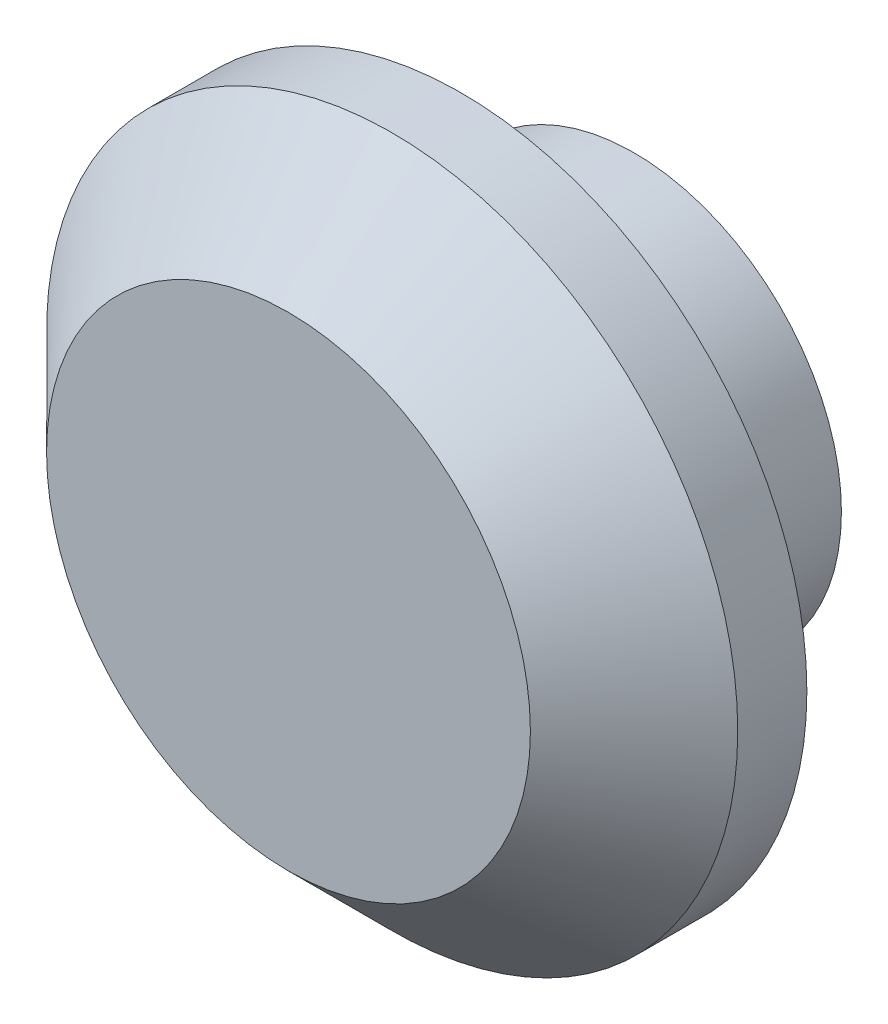
ISO-10303-21;
HEADER;
FILE_DESCRIPTION(('STEP AP214'),'2;1');
FILE_NAME('part.step','',(''),(''),'','','');
FILE_SCHEMA(('AUTOMOTIVE_DESIGN { 1 0 10303 214 1 1 1 1 }'));
ENDSEC;
DATA;
#1=APPLICATION_CONTEXT('core data for automotive mechanical design processes');
#2=APPLICATION_PROTOCOL_DEFINITION('international standard','automotive_design',2000,#1);
#3=PRODUCT_CONTEXT('',#1,'mechanical');
#4=PRODUCT('Part','Part','',(#3));
#5=PRODUCT_RELATED_PRODUCT_CATEGORY('part','',(#4));
#6=PRODUCT_DEFINITION_FORMATION('','',#4);
#7=PRODUCT_DEFINITION_CONTEXT('part definition',#1,'design');
#8=PRODUCT_DEFINITION('design','',#6,#7);
#9=PRODUCT_DEFINITION_SHAPE('','',#8);
#10=(LENGTH_UNIT() NAMED_UNIT(*) SI_UNIT(.MILLI.,.METRE.));
#11=(NAMED_UNIT(*) PLANE_ANGLE_UNIT() SI_UNIT($,.RADIAN.));
#12=(NAMED_UNIT(*) SI_UNIT($,.STERADIAN.) SOLID_ANGLE_UNIT());
#13=UNCERTAINTY_MEASURE_WITH_UNIT(LENGTH_MEASURE(1.E-05),#10,'distance_accuracy_value','');
#14=(GEOMETRIC_REPRESENTATION_CONTEXT(3) GLOBAL_UNCERTAINTY_ASSIGNED_CONTEXT((#13)) GLOBAL_UNIT_ASSIGNED_CONTEXT((#10,
#11,#12)) REPRESENTATION_CONTEXT('',''));
#15=CARTESIAN_POINT('',(0.,0.,0.));
#16=DIRECTION('',(0.,0.,1.));
#17=DIRECTION('',(1.,0.,0.));
#18=AXIS2_PLACEMENT_3D('',#15,#16,#17);
#19=CARTESIAN_POINT('',(0.,0.,5.));
#20=DIRECTION('',(0.,0.,-1.));
#21=DIRECTION('',(-1.,0.,0.));
#22=AXIS2_PLACEMENT_3D('',#19,#20,#21);
#23=CYLINDRICAL_SURFACE('',#22,6.);
#24=CARTESIAN_POINT('',(0.,0.,-5.));
#25=DIRECTION('',(0.,0.,1.));
#26=DIRECTION('',(1.,0.,0.));
#27=AXIS2_PLACEMENT_3D('',#24,#25,#26);
#28=CIRCLE('',#27,6.);
#29=CARTESIAN_POINT('',(6.,0.,-5.));
#30=VERTEX_POINT('',#29);
#31=EDGE_CURVE('E49',#30,#30,#28,.T.);
#32=ORIENTED_EDGE('',*,*,#31,.T.);
#33=EDGE_LOOP('',(#32));
#34=FACE_BOUND('',#33,.T.);
#35=CARTESIAN_POINT('',(0.,0.,0.));
#36=DIRECTION('',(0.,0.,1.));
#37=DIRECTION('',(1.,0.,0.));
#38=AXIS2_PLACEMENT_3D('',#35,#36,#37);
#39=CIRCLE('',#38,6.);
#40=CARTESIAN_POINT('',(6.,0.,0.));
#41=VERTEX_POINT('',#40);
#42=EDGE_CURVE('E45',#41,#41,#39,.T.);
#43=ORIENTED_EDGE('',*,*,#42,.F.);
#44=EDGE_LOOP('',(#43));
#45=FACE_BOUND('',#44,.T.);
#46=ADVANCED_FACE('F33',(#34,#45),#23,.T.);
#47=CARTESIAN_POINT('',(0.,0.,5.));
#48=DIRECTION('',(0.,0.,-1.));
#49=DIRECTION('',(-1.,0.,0.));
#50=AXIS2_PLACEMENT_3D('',#47,#48,#49);
#51=CYLINDRICAL_SURFACE('',#50,3.25);
#52=CARTESIAN_POINT('',(0.,0.,-5.));
#53=DIRECTION('',(0.,0.,1.));
#54=DIRECTION('',(1.,0.,0.));
#55=AXIS2_PLACEMENT_3D('',#52,#53,#54);
#56=CIRCLE('',#55,3.25);
#57=CARTESIAN_POINT('',(3.25000000000001,0.,-5.));
#58=VERTEX_POINT('',#57);
#59=EDGE_CURVE('E55',#58,#58,#56,.T.);
#60=ORIENTED_EDGE('',*,*,#59,.F.);
#61=EDGE_LOOP('',(#60));
#62=FACE_BOUND('',#61,.T.);
#63=CARTESIAN_POINT('',(0.,0.,0.));
#64=DIRECTION('',(0.,0.,1.));
#65=DIRECTION('',(1.,0.,0.));
#66=AXIS2_PLACEMENT_3D('',#63,#64,#65);
#67=CIRCLE('',#66,3.25);
#68=CARTESIAN_POINT('',(3.25000000000001,0.,0.));
#69=VERTEX_POINT('',#68);
#70=EDGE_CURVE('E52',#69,#69,#67,.T.);
#71=ORIENTED_EDGE('',*,*,#70,.T.);
#72=EDGE_LOOP('',(#71));
#73=FACE_BOUND('',#72,.T.);
#74=ADVANCED_FACE('F82',(#62,#73),#51,.F.);
#75=CARTESIAN_POINT('',(0.,0.,-5.));
#76=DIRECTION('',(0.,0.,1.));
#77=DIRECTION('',(1.,0.,0.));
#78=AXIS2_PLACEMENT_3D('',#75,#76,#77);
#79=PLANE('',#78);
#80=ORIENTED_EDGE('',*,*,#59,.T.);
#81=EDGE_LOOP('',(#80));
#82=FACE_BOUND('',#81,.T.);
#83=ORIENTED_EDGE('',*,*,#31,.F.);
#84=EDGE_LOOP('',(#83));
#85=FACE_BOUND('',#84,.T.);
#86=ADVANCED_FACE('F79',(#82,#85),#79,.F.);
#87=CARTESIAN_POINT('',(0.,0.,0.));
#88=DIRECTION('',(0.,0.,1.));
#89=DIRECTION('',(1.,0.,0.));
#90=AXIS2_PLACEMENT_3D('',#87,#88,#89);
#91=PLANE('',#90);
#92=ORIENTED_EDGE('',*,*,#70,.F.);
#93=EDGE_LOOP('',(#92));
#94=FACE_BOUND('',#93,.T.);
#95=ADVANCED_FACE('F71',(#94),#91,.F.);
#96=CARTESIAN_POINT('',(0.,0.,5.));
#97=DIRECTION('',(0.,0.,-1.));
#98=DIRECTION('',(-1.,0.,0.));
#99=AXIS2_PLACEMENT_3D('',#96,#97,#98);
#100=CYLINDRICAL_SURFACE('',#99,10.0000001490116);
#101=CARTESIAN_POINT('',(0.,0.,1.99999999999999));
#102=DIRECTION('',(0.,0.,1.));
#103=DIRECTION('',(1.,0.,0.));
#104=AXIS2_PLACEMENT_3D('',#101,#102,#103);
#105=CIRCLE('',#104,10.0000001490116);
#106=CARTESIAN_POINT('',(10.0000001490117,0.,1.99999999999999));
#107=VERTEX_POINT('',#106);
#108=EDGE_CURVE('E10',#107,#107,#105,.F.);
#109=ORIENTED_EDGE('',*,*,#108,.T.);
#110=EDGE_LOOP('',(#109));
#111=FACE_BOUND('',#110,.T.);
#112=CARTESIAN_POINT('',(0.,0.,0.));
#113=DIRECTION('',(0.,0.,1.));
#114=DIRECTION('',(1.,0.,0.));
#115=AXIS2_PLACEMENT_3D('',#112,#113,#114);
#116=CIRCLE('',#115,10.0000001490116);
#117=CARTESIAN_POINT('',(10.0000001490117,0.,0.));
#118=VERTEX_POINT('',#117);
#119=EDGE_CURVE('E56',#118,#118,#116,.T.);
#120=ORIENTED_EDGE('',*,*,#119,.T.);
#121=EDGE_LOOP('',(#120));
#122=FACE_BOUND('',#121,.T.);
#123=ADVANCED_FACE('F64',(#111,#122),#100,.T.);
#124=ORIENTED_EDGE('',*,*,#42,.T.);
#125=EDGE_LOOP('',(#124));
#126=FACE_BOUND('',#125,.T.);
#127=ORIENTED_EDGE('',*,*,#119,.F.);
#128=EDGE_LOOP('',(#127));
#129=FACE_BOUND('',#128,.T.);
#130=ADVANCED_FACE('F66',(#126,#129),#91,.F.);
#131=CARTESIAN_POINT('',(0.,0.,5.));
#132=DIRECTION('',(0.,0.,1.));
#133=DIRECTION('',(1.,0.,0.));
#134=AXIS2_PLACEMENT_3D('',#131,#132,#133);
#135=PLANE('',#134);
#136=CARTESIAN_POINT('',(0.,0.,5.));
#137=DIRECTION('',(0.,0.,1.));
#138=DIRECTION('',(1.,0.,0.));
#139=AXIS2_PLACEMENT_3D('',#136,#137,#138);
#140=CIRCLE('',#139,7.00000014901165);
#141=CARTESIAN_POINT('',(7.00000014901166,0.,5.));
#142=VERTEX_POINT('',#141);
#143=EDGE_CURVE('E41',#142,#142,#140,.T.);
#144=ORIENTED_EDGE('',*,*,#143,.T.);
#145=EDGE_LOOP('',(#144));
#146=FACE_BOUND('',#145,.T.);
#147=ADVANCED_FACE('F68',(#146),#135,.T.);
#148=CARTESIAN_POINT('',(0.,0.,5.));
#149=DIRECTION('',(0.,0.,-1.));
#150=DIRECTION('',(-1.,0.,0.));
#151=AXIS2_PLACEMENT_3D('',#148,#149,#150);
#152=CONICAL_SURFACE('',#151,7.00000014901165,0.785398163397447);
#153=ORIENTED_EDGE('',*,*,#108,.F.);
#154=EDGE_LOOP('',(#153));
#155=FACE_BOUND('',#154,.T.);
#156=ORIENTED_EDGE('',*,*,#143,.F.);
#157=EDGE_LOOP('',(#156));
#158=FACE_BOUND('',#157,.T.);
#159=ADVANCED_FACE('F36',(#155,#158),#152,.T.);
#160=CLOSED_SHELL('',(#46,#74,#86,#95,#123,#130,#147,#159));
#161=MANIFOLD_SOLID_BREP('B2',#160);
#162=ADVANCED_BREP_SHAPE_REPRESENTATION('',(#18,#161),#14);
#163=SHAPE_DEFINITION_REPRESENTATION(#9,#162);
ENDSEC;
END-ISO-10303-21;
